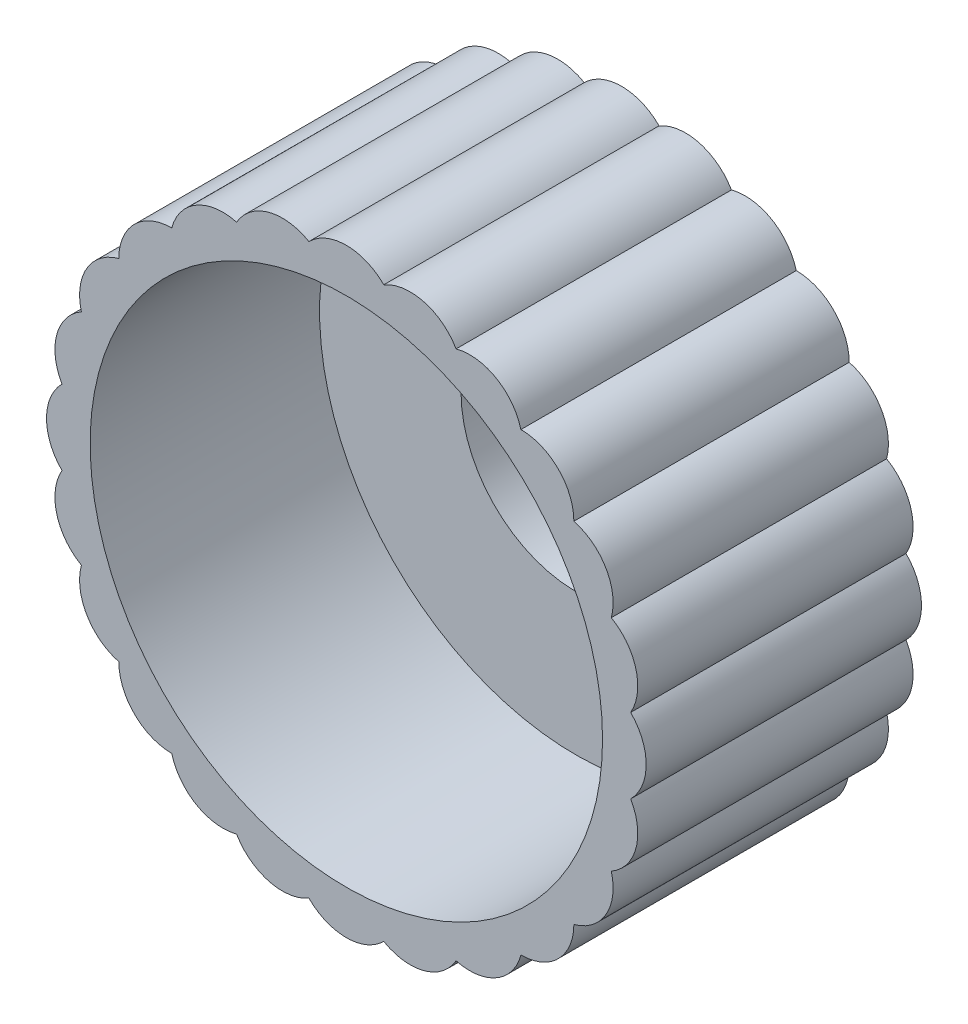
ISO-10303-21;
HEADER;
FILE_DESCRIPTION(('STEP AP214'),'2;1');
FILE_NAME('part.step','',(''),(''),'','','');
FILE_SCHEMA(('AUTOMOTIVE_DESIGN { 1 0 10303 214 1 1 1 1 }'));
ENDSEC;
DATA;
#1=APPLICATION_CONTEXT('core data for automotive mechanical design processes');
#2=APPLICATION_PROTOCOL_DEFINITION('international standard','automotive_design',2000,#1);
#3=PRODUCT_CONTEXT('',#1,'mechanical');
#4=PRODUCT('Part','Part','',(#3));
#5=PRODUCT_RELATED_PRODUCT_CATEGORY('part','',(#4));
#6=PRODUCT_DEFINITION_FORMATION('','',#4);
#7=PRODUCT_DEFINITION_CONTEXT('part definition',#1,'design');
#8=PRODUCT_DEFINITION('design','',#6,#7);
#9=PRODUCT_DEFINITION_SHAPE('','',#8);
#10=(LENGTH_UNIT() NAMED_UNIT(*) SI_UNIT(.MILLI.,.METRE.));
#11=(NAMED_UNIT(*) PLANE_ANGLE_UNIT() SI_UNIT($,.RADIAN.));
#12=(NAMED_UNIT(*) SI_UNIT($,.STERADIAN.) SOLID_ANGLE_UNIT());
#13=UNCERTAINTY_MEASURE_WITH_UNIT(LENGTH_MEASURE(1.E-05),#10,'distance_accuracy_value','');
#14=(GEOMETRIC_REPRESENTATION_CONTEXT(3) GLOBAL_UNCERTAINTY_ASSIGNED_CONTEXT((#13)) GLOBAL_UNIT_ASSIGNED_CONTEXT((#10,
#11,#12)) REPRESENTATION_CONTEXT('',''));
#15=CARTESIAN_POINT('',(0.,0.,0.));
#16=DIRECTION('',(0.,0.,1.));
#17=DIRECTION('',(1.,0.,0.));
#18=AXIS2_PLACEMENT_3D('',#15,#16,#17);
#19=CARTESIAN_POINT('',(0.,0.,15.));
#20=DIRECTION('',(0.,0.,1.));
#21=DIRECTION('',(1.,0.,0.));
#22=AXIS2_PLACEMENT_3D('',#19,#20,#21);
#23=PLANE('',#22);
#24=CARTESIAN_POINT('',(0.,16.142225046633,15.));
#25=DIRECTION('',(0.,0.,1.));
#26=DIRECTION('',(1.,0.,0.));
#27=AXIS2_PLACEMENT_3D('',#24,#25,#26);
#28=CIRCLE('',#27,3.46109833654717);
#29=CARTESIAN_POINT('',(-2.4473661041257,18.589591150759,15.));
#30=VERTEX_POINT('',#29);
#31=CARTESIAN_POINT('',(2.44736610412596,18.589591150759,15.));
#32=VERTEX_POINT('',#31);
#33=EDGE_CURVE('E202',#30,#32,#28,.F.);
#34=ORIENTED_EDGE('',*,*,#33,.F.);
#35=CARTESIAN_POINT('',(-4.17791527239933,15.5921920663131,15.));
#36=DIRECTION('',(0.,0.,1.));
#37=DIRECTION('',(1.,0.,0.));
#38=AXIS2_PLACEMENT_3D('',#35,#36,#37);
#39=CIRCLE('',#38,3.46109833654717);
#40=CARTESIAN_POINT('',(-7.17531435684522,17.3227412345867,15.));
#41=VERTEX_POINT('',#40);
#42=EDGE_CURVE('E195',#41,#30,#39,.F.);
#43=ORIENTED_EDGE('',*,*,#42,.F.);
#44=CARTESIAN_POINT('',(-8.07111252331631,13.9795769639897,15.));
#45=DIRECTION('',(0.,0.,1.));
#46=DIRECTION('',(1.,0.,0.));
#47=AXIS2_PLACEMENT_3D('',#44,#45,#46);
#48=CIRCLE('',#47,3.46109833654717);
#49=CARTESIAN_POINT('',(-11.4142767939133,14.8753751304608,15.));
#50=VERTEX_POINT('',#49);
#51=EDGE_CURVE('E199',#50,#41,#48,.F.);
#52=ORIENTED_EDGE('',*,*,#51,.F.);
#53=CARTESIAN_POINT('',(-11.4142767939134,11.4142767939136,15.));
#54=DIRECTION('',(0.,0.,1.));
#55=DIRECTION('',(1.,0.,0.));
#56=AXIS2_PLACEMENT_3D('',#53,#54,#55);
#57=CIRCLE('',#56,3.46109833654717);
#58=CARTESIAN_POINT('',(-14.8753751304605,11.4142767939137,15.));
#59=VERTEX_POINT('',#58);
#60=EDGE_CURVE('E226',#59,#50,#57,.F.);
#61=ORIENTED_EDGE('',*,*,#60,.F.);
#62=CARTESIAN_POINT('',(-13.9795769639895,8.07111252331665,15.));
#63=DIRECTION('',(0.,0.,1.));
#64=DIRECTION('',(1.,0.,0.));
#65=AXIS2_PLACEMENT_3D('',#62,#63,#64);
#66=CIRCLE('',#65,3.46109833654717);
#67=CARTESIAN_POINT('',(-17.3227412345866,7.17531435684562,15.));
#68=VERTEX_POINT('',#67);
#69=EDGE_CURVE('E234',#68,#59,#66,.F.);
#70=ORIENTED_EDGE('',*,*,#69,.F.);
#71=CARTESIAN_POINT('',(-15.592192066313,4.17791527239971,15.));
#72=DIRECTION('',(0.,0.,1.));
#73=DIRECTION('',(1.,0.,0.));
#74=AXIS2_PLACEMENT_3D('',#71,#72,#73);
#75=CIRCLE('',#74,3.46109833654717);
#76=CARTESIAN_POINT('',(-18.5895911507589,2.44736610412616,15.));
#77=VERTEX_POINT('',#76);
#78=EDGE_CURVE('E243',#77,#68,#75,.F.);
#79=ORIENTED_EDGE('',*,*,#78,.F.);
#80=CARTESIAN_POINT('',(-16.142225046633,1.69075025761758E-13,15.));
#81=DIRECTION('',(0.,0.,1.));
#82=DIRECTION('',(1.,0.,0.));
#83=AXIS2_PLACEMENT_3D('',#80,#81,#82);
#84=CIRCLE('',#83,3.46109833654717);
#85=CARTESIAN_POINT('',(-18.589591150759,-2.44736610412579,15.));
#86=VERTEX_POINT('',#85);
#87=EDGE_CURVE('E252',#86,#77,#84,.F.);
#88=ORIENTED_EDGE('',*,*,#87,.F.);
#89=CARTESIAN_POINT('',(-15.5921920663131,-4.17791527239939,15.));
#90=DIRECTION('',(0.,0.,1.));
#91=DIRECTION('',(1.,0.,0.));
#92=AXIS2_PLACEMENT_3D('',#89,#90,#91);
#93=CIRCLE('',#92,3.46109833654717);
#94=CARTESIAN_POINT('',(-17.3227412345867,-7.17531435684528,15.));
#95=VERTEX_POINT('',#94);
#96=EDGE_CURVE('E261',#95,#86,#93,.F.);
#97=ORIENTED_EDGE('',*,*,#96,.F.);
#98=CARTESIAN_POINT('',(-13.9795769639897,-8.07111252331635,15.));
#99=DIRECTION('',(0.,0.,1.));
#100=DIRECTION('',(1.,0.,0.));
#101=AXIS2_PLACEMENT_3D('',#98,#99,#100);
#102=CIRCLE('',#101,3.46109833654717);
#103=CARTESIAN_POINT('',(-14.8753751304608,-11.4142767939134,15.));
#104=VERTEX_POINT('',#103);
#105=EDGE_CURVE('E270',#104,#95,#102,.F.);
#106=ORIENTED_EDGE('',*,*,#105,.F.);
#107=CARTESIAN_POINT('',(-11.4142767939136,-11.4142767939134,15.));
#108=DIRECTION('',(0.,0.,1.));
#109=DIRECTION('',(1.,0.,0.));
#110=AXIS2_PLACEMENT_3D('',#107,#108,#109);
#111=CIRCLE('',#110,3.46109833654717);
#112=CARTESIAN_POINT('',(-11.4142767939136,-14.8753751304606,15.));
#113=VERTEX_POINT('',#112);
#114=EDGE_CURVE('E279',#113,#104,#111,.F.);
#115=ORIENTED_EDGE('',*,*,#114,.F.);
#116=CARTESIAN_POINT('',(-8.0711125233166,-13.9795769639895,15.));
#117=DIRECTION('',(0.,0.,1.));
#118=DIRECTION('',(1.,0.,0.));
#119=AXIS2_PLACEMENT_3D('',#116,#117,#118);
#120=CIRCLE('',#119,3.46109833654717);
#121=CARTESIAN_POINT('',(-7.17531435684556,-17.3227412345866,15.));
#122=VERTEX_POINT('',#121);
#123=EDGE_CURVE('E288',#122,#113,#120,.F.);
#124=ORIENTED_EDGE('',*,*,#123,.F.);
#125=CARTESIAN_POINT('',(-4.17791527239966,-15.592192066313,15.));
#126=DIRECTION('',(0.,0.,1.));
#127=DIRECTION('',(1.,0.,0.));
#128=AXIS2_PLACEMENT_3D('',#125,#126,#127);
#129=CIRCLE('',#128,3.46109833654717);
#130=CARTESIAN_POINT('',(-2.44736610412609,-18.5895911507589,15.));
#131=VERTEX_POINT('',#130);
#132=EDGE_CURVE('E297',#131,#122,#129,.F.);
#133=ORIENTED_EDGE('',*,*,#132,.F.);
#134=CARTESIAN_POINT('',(0.,-16.142225046633,15.));
#135=DIRECTION('',(0.,0.,1.));
#136=DIRECTION('',(1.,0.,0.));
#137=AXIS2_PLACEMENT_3D('',#134,#135,#136);
#138=CIRCLE('',#137,3.46109833654717);
#139=CARTESIAN_POINT('',(2.44736610412599,-18.589591150759,15.));
#140=VERTEX_POINT('',#139);
#141=EDGE_CURVE('E306',#140,#131,#138,.F.);
#142=ORIENTED_EDGE('',*,*,#141,.F.);
#143=CARTESIAN_POINT('',(4.17791527239944,-15.5921920663131,15.));
#144=DIRECTION('',(0.,0.,1.));
#145=DIRECTION('',(1.,0.,0.));
#146=AXIS2_PLACEMENT_3D('',#143,#144,#145);
#147=CIRCLE('',#146,3.46109833654717);
#148=CARTESIAN_POINT('',(7.17531435684534,-17.3227412345867,15.));
#149=VERTEX_POINT('',#148);
#150=EDGE_CURVE('E315',#149,#140,#147,.F.);
#151=ORIENTED_EDGE('',*,*,#150,.F.);
#152=CARTESIAN_POINT('',(8.0711125233164,-13.9795769639896,15.));
#153=DIRECTION('',(0.,0.,1.));
#154=DIRECTION('',(1.,0.,0.));
#155=AXIS2_PLACEMENT_3D('',#152,#153,#154);
#156=CIRCLE('',#155,3.46109833654717);
#157=CARTESIAN_POINT('',(11.4142767939134,-14.8753751304607,15.));
#158=VERTEX_POINT('',#157);
#159=EDGE_CURVE('E324',#158,#149,#156,.F.);
#160=ORIENTED_EDGE('',*,*,#159,.F.);
#161=CARTESIAN_POINT('',(11.4142767939134,-11.4142767939136,15.));
#162=DIRECTION('',(0.,0.,1.));
#163=DIRECTION('',(1.,0.,0.));
#164=AXIS2_PLACEMENT_3D('',#161,#162,#163);
#165=CIRCLE('',#164,3.46109833654717);
#166=CARTESIAN_POINT('',(14.8753751304606,-11.4142767939136,15.));
#167=VERTEX_POINT('',#166);
#168=EDGE_CURVE('E333',#167,#158,#165,.F.);
#169=ORIENTED_EDGE('',*,*,#168,.F.);
#170=CARTESIAN_POINT('',(13.9795769639896,-8.07111252331655,15.));
#171=DIRECTION('',(0.,0.,1.));
#172=DIRECTION('',(1.,0.,0.));
#173=AXIS2_PLACEMENT_3D('',#170,#171,#172);
#174=CIRCLE('',#173,3.46109833654717);
#175=CARTESIAN_POINT('',(17.3227412345866,-7.1753143568455,15.));
#176=VERTEX_POINT('',#175);
#177=EDGE_CURVE('E342',#176,#167,#174,.F.);
#178=ORIENTED_EDGE('',*,*,#177,.F.);
#179=CARTESIAN_POINT('',(15.592192066313,-4.1779152723996,15.));
#180=DIRECTION('',(0.,0.,1.));
#181=DIRECTION('',(1.,0.,0.));
#182=AXIS2_PLACEMENT_3D('',#179,#180,#181);
#183=CIRCLE('',#182,3.46109833654717);
#184=CARTESIAN_POINT('',(18.5895911507589,-2.44736610412602,15.));
#185=VERTEX_POINT('',#184);
#186=EDGE_CURVE('E351',#185,#176,#183,.F.);
#187=ORIENTED_EDGE('',*,*,#186,.F.);
#188=CARTESIAN_POINT('',(16.142225046633,0.,15.));
#189=DIRECTION('',(0.,0.,1.));
#190=DIRECTION('',(1.,0.,0.));
#191=AXIS2_PLACEMENT_3D('',#188,#189,#190);
#192=CIRCLE('',#191,3.46109833654717);
#193=CARTESIAN_POINT('',(18.589591150759,2.44736610412592,15.));
#194=VERTEX_POINT('',#193);
#195=EDGE_CURVE('E360',#194,#185,#192,.F.);
#196=ORIENTED_EDGE('',*,*,#195,.F.);
#197=CARTESIAN_POINT('',(15.5921920663131,4.17791527239949,15.));
#198=DIRECTION('',(0.,0.,1.));
#199=DIRECTION('',(1.,0.,0.));
#200=AXIS2_PLACEMENT_3D('',#197,#198,#199);
#201=CIRCLE('',#200,3.46109833654717);
#202=CARTESIAN_POINT('',(17.3227412345867,7.1753143568454,15.));
#203=VERTEX_POINT('',#202);
#204=EDGE_CURVE('E369',#203,#194,#201,.F.);
#205=ORIENTED_EDGE('',*,*,#204,.F.);
#206=CARTESIAN_POINT('',(13.9795769639896,8.07111252331645,15.));
#207=DIRECTION('',(0.,0.,1.));
#208=DIRECTION('',(1.,0.,0.));
#209=AXIS2_PLACEMENT_3D('',#206,#207,#208);
#210=CIRCLE('',#209,3.46109833654717);
#211=CARTESIAN_POINT('',(14.8753751304607,11.4142767939135,15.));
#212=VERTEX_POINT('',#211);
#213=EDGE_CURVE('E378',#212,#203,#210,.F.);
#214=ORIENTED_EDGE('',*,*,#213,.F.);
#215=CARTESIAN_POINT('',(11.4142767939135,11.4142767939135,15.));
#216=DIRECTION('',(0.,0.,1.));
#217=DIRECTION('',(1.,0.,0.));
#218=AXIS2_PLACEMENT_3D('',#215,#216,#217);
#219=CIRCLE('',#218,3.46109833654717);
#220=CARTESIAN_POINT('',(11.4142767939135,14.8753751304607,15.));
#221=VERTEX_POINT('',#220);
#222=EDGE_CURVE('E386',#221,#212,#219,.F.);
#223=ORIENTED_EDGE('',*,*,#222,.F.);
#224=CARTESIAN_POINT('',(8.0711125233165,13.9795769639896,15.));
#225=DIRECTION('',(0.,0.,1.));
#226=DIRECTION('',(1.,0.,0.));
#227=AXIS2_PLACEMENT_3D('',#224,#225,#226);
#228=CIRCLE('',#227,3.46109833654717);
#229=CARTESIAN_POINT('',(7.17531435684544,17.3227412345866,15.));
#230=VERTEX_POINT('',#229);
#231=EDGE_CURVE('E393',#230,#221,#228,.F.);
#232=ORIENTED_EDGE('',*,*,#231,.F.);
#233=CARTESIAN_POINT('',(4.17791527239955,15.592192066313,15.));
#234=DIRECTION('',(0.,0.,1.));
#235=DIRECTION('',(1.,0.,0.));
#236=AXIS2_PLACEMENT_3D('',#233,#234,#235);
#237=CIRCLE('',#236,3.46109833654717);
#238=EDGE_CURVE('E398',#32,#230,#237,.F.);
#239=ORIENTED_EDGE('',*,*,#238,.F.);
#240=EDGE_LOOP('',(#34,#43,#52,#61,#70,#79,#88,#97,#106,#115,#124,#133,#142,#151,#160,#169,#178,
#187,#196,#205,#214,#223,#232,#239));
#241=FACE_BOUND('',#240,.T.);
#242=CARTESIAN_POINT('',(0.,0.,15.));
#243=DIRECTION('',(0.,0.,1.));
#244=DIRECTION('',(1.,0.,0.));
#245=AXIS2_PLACEMENT_3D('',#242,#243,#244);
#246=CIRCLE('',#245,16.75);
#247=CARTESIAN_POINT('',(16.75,0.,15.));
#248=VERTEX_POINT('',#247);
#249=EDGE_CURVE('E11',#248,#248,#246,.T.);
#250=ORIENTED_EDGE('',*,*,#249,.F.);
#251=EDGE_LOOP('',(#250));
#252=FACE_BOUND('',#251,.T.);
#253=ADVANCED_FACE('F33',(#241,#252),#23,.T.);
#254=CARTESIAN_POINT('',(0.,0.,15.));
#255=DIRECTION('',(0.,0.,-1.));
#256=DIRECTION('',(-1.,0.,0.));
#257=AXIS2_PLACEMENT_3D('',#254,#255,#256);
#258=CYLINDRICAL_SURFACE('',#257,16.75);
#259=ORIENTED_EDGE('',*,*,#249,.T.);
#260=EDGE_LOOP('',(#259));
#261=FACE_BOUND('',#260,.T.);
#262=CARTESIAN_POINT('',(0.,0.,0.));
#263=DIRECTION('',(0.,0.,1.));
#264=DIRECTION('',(1.,0.,0.));
#265=AXIS2_PLACEMENT_3D('',#262,#263,#264);
#266=CIRCLE('',#265,16.75);
#267=CARTESIAN_POINT('',(16.75,0.,0.));
#268=VERTEX_POINT('',#267);
#269=EDGE_CURVE('E36',#268,#268,#266,.T.);
#270=ORIENTED_EDGE('',*,*,#269,.F.);
#271=EDGE_LOOP('',(#270));
#272=FACE_BOUND('',#271,.T.);
#273=ADVANCED_FACE('F437',(#261,#272),#258,.F.);
#274=CARTESIAN_POINT('',(0.,0.,0.));
#275=DIRECTION('',(0.,0.,-1.));
#276=DIRECTION('',(-1.,0.,0.));
#277=AXIS2_PLACEMENT_3D('',#274,#275,#276);
#278=PLANE('',#277);
#279=CARTESIAN_POINT('',(0.,0.,0.));
#280=DIRECTION('',(0.,0.,-1.));
#281=DIRECTION('',(-1.,0.,0.));
#282=AXIS2_PLACEMENT_3D('',#279,#280,#281);
#283=CIRCLE('',#282,7.5);
#284=CARTESIAN_POINT('',(-7.5,0.,0.));
#285=VERTEX_POINT('',#284);
#286=EDGE_CURVE('E411',#285,#285,#283,.T.);
#287=ORIENTED_EDGE('',*,*,#286,.T.);
#288=EDGE_LOOP('',(#287));
#289=FACE_BOUND('',#288,.T.);
#290=ORIENTED_EDGE('',*,*,#269,.T.);
#291=EDGE_LOOP('',(#290));
#292=FACE_BOUND('',#291,.T.);
#293=ADVANCED_FACE('F418',(#289,#292),#278,.F.);
#294=CARTESIAN_POINT('',(0.,0.,-3.));
#295=DIRECTION('',(0.,0.,-1.));
#296=DIRECTION('',(-1.,0.,0.));
#297=AXIS2_PLACEMENT_3D('',#294,#295,#296);
#298=PLANE('',#297);
#299=CARTESIAN_POINT('',(0.,16.142225046633,-3.));
#300=DIRECTION('',(0.,0.,-1.));
#301=DIRECTION('',(1.,0.,0.));
#302=AXIS2_PLACEMENT_3D('',#299,#300,#301);
#303=CIRCLE('',#302,3.46109833654717);
#304=CARTESIAN_POINT('',(-2.4473661041257,18.589591150759,-3.));
#305=VERTEX_POINT('',#304);
#306=CARTESIAN_POINT('',(2.44736610412599,18.589591150759,-3.));
#307=VERTEX_POINT('',#306);
#308=EDGE_CURVE('E403',#305,#307,#303,.T.);
#309=ORIENTED_EDGE('',*,*,#308,.T.);
#310=CARTESIAN_POINT('',(4.17791527239955,15.592192066313,-3.));
#311=DIRECTION('',(0.,0.,-1.));
#312=DIRECTION('',(0.965925826289068,-0.258819045102521,0.));
#313=AXIS2_PLACEMENT_3D('',#310,#311,#312);
#314=CIRCLE('',#313,3.46109833654717);
#315=CARTESIAN_POINT('',(7.17531435684547,17.3227412345866,-3.));
#316=VERTEX_POINT('',#315);
#317=EDGE_CURVE('E47',#307,#316,#314,.T.);
#318=ORIENTED_EDGE('',*,*,#317,.T.);
#319=CARTESIAN_POINT('',(8.0711125233165,13.9795769639896,-3.));
#320=DIRECTION('',(0.,0.,-1.));
#321=DIRECTION('',(0.866025403784438,-0.500000000000001,0.));
#322=AXIS2_PLACEMENT_3D('',#319,#320,#321);
#323=CIRCLE('',#322,3.46109833654717);
#324=CARTESIAN_POINT('',(11.4142767939136,14.8753751304606,-3.));
#325=VERTEX_POINT('',#324);
#326=EDGE_CURVE('E56',#316,#325,#323,.T.);
#327=ORIENTED_EDGE('',*,*,#326,.T.);
#328=CARTESIAN_POINT('',(11.4142767939135,11.4142767939135,-3.));
#329=DIRECTION('',(0.,0.,-1.));
#330=DIRECTION('',(0.707106781186546,-0.707106781186549,0.));
#331=AXIS2_PLACEMENT_3D('',#328,#329,#330);
#332=CIRCLE('',#331,3.46109833654717);
#333=CARTESIAN_POINT('',(14.8753751304607,11.4142767939135,-3.));
#334=VERTEX_POINT('',#333);
#335=EDGE_CURVE('E377',#325,#334,#332,.T.);
#336=ORIENTED_EDGE('',*,*,#335,.T.);
#337=CARTESIAN_POINT('',(13.9795769639896,8.07111252331645,-3.));
#338=DIRECTION('',(0.,0.,-1.));
#339=DIRECTION('',(0.499999999999998,-0.86602540378444,0.));
#340=AXIS2_PLACEMENT_3D('',#337,#338,#339);
#341=CIRCLE('',#340,3.46109833654717);
#342=CARTESIAN_POINT('',(17.3227412345867,7.17531435684538,-3.));
#343=VERTEX_POINT('',#342);
#344=EDGE_CURVE('E368',#334,#343,#341,.T.);
#345=ORIENTED_EDGE('',*,*,#344,.T.);
#346=CARTESIAN_POINT('',(15.5921920663131,4.17791527239949,-3.));
#347=DIRECTION('',(0.,0.,-1.));
#348=DIRECTION('',(0.258819045102518,-0.965925826289069,0.));
#349=AXIS2_PLACEMENT_3D('',#346,#347,#348);
#350=CIRCLE('',#349,3.46109833654717);
#351=CARTESIAN_POINT('',(18.589591150759,2.4473661041259,-3.));
#352=VERTEX_POINT('',#351);
#353=EDGE_CURVE('E359',#343,#352,#350,.T.);
#354=ORIENTED_EDGE('',*,*,#353,.T.);
#355=CARTESIAN_POINT('',(16.142225046633,0.,-3.));
#356=DIRECTION('',(0.,0.,-1.));
#357=DIRECTION('',(0.,-1.,0.));
#358=AXIS2_PLACEMENT_3D('',#355,#356,#357);
#359=CIRCLE('',#358,3.46109833654717);
#360=CARTESIAN_POINT('',(18.5895911507589,-2.44736610412605,-3.));
#361=VERTEX_POINT('',#360);
#362=EDGE_CURVE('E350',#352,#361,#359,.T.);
#363=ORIENTED_EDGE('',*,*,#362,.T.);
#364=CARTESIAN_POINT('',(15.592192066313,-4.1779152723996,-3.));
#365=DIRECTION('',(0.,0.,-1.));
#366=DIRECTION('',(-0.258819045102525,-0.965925826289067,0.));
#367=AXIS2_PLACEMENT_3D('',#364,#365,#366);
#368=CIRCLE('',#367,3.46109833654717);
#369=CARTESIAN_POINT('',(17.3227412345866,-7.17531435684553,-3.));
#370=VERTEX_POINT('',#369);
#371=EDGE_CURVE('E341',#361,#370,#368,.T.);
#372=ORIENTED_EDGE('',*,*,#371,.T.);
#373=CARTESIAN_POINT('',(13.9795769639896,-8.07111252331655,-3.));
#374=DIRECTION('',(0.,0.,-1.));
#375=DIRECTION('',(-0.500000000000004,-0.866025403784436,0.));
#376=AXIS2_PLACEMENT_3D('',#373,#374,#375);
#377=CIRCLE('',#376,3.46109833654717);
#378=CARTESIAN_POINT('',(14.8753751304606,-11.4142767939136,-3.));
#379=VERTEX_POINT('',#378);
#380=EDGE_CURVE('E332',#370,#379,#377,.T.);
#381=ORIENTED_EDGE('',*,*,#380,.T.);
#382=CARTESIAN_POINT('',(11.4142767939134,-11.4142767939136,-3.));
#383=DIRECTION('',(0.,0.,-1.));
#384=DIRECTION('',(-0.707106781186551,-0.707106781186544,0.));
#385=AXIS2_PLACEMENT_3D('',#382,#383,#384);
#386=CIRCLE('',#385,3.46109833654717);
#387=CARTESIAN_POINT('',(11.4142767939134,-14.8753751304607,-3.));
#388=VERTEX_POINT('',#387);
#389=EDGE_CURVE('E323',#379,#388,#386,.T.);
#390=ORIENTED_EDGE('',*,*,#389,.T.);
#391=CARTESIAN_POINT('',(8.0711125233164,-13.9795769639896,-3.));
#392=DIRECTION('',(0.,0.,-1.));
#393=DIRECTION('',(-0.866025403784442,-0.499999999999995,0.));
#394=AXIS2_PLACEMENT_3D('',#391,#392,#393);
#395=CIRCLE('',#394,3.46109833654717);
#396=CARTESIAN_POINT('',(7.17531435684532,-17.3227412345867,-3.));
#397=VERTEX_POINT('',#396);
#398=EDGE_CURVE('E314',#388,#397,#395,.T.);
#399=ORIENTED_EDGE('',*,*,#398,.T.);
#400=CARTESIAN_POINT('',(4.17791527239944,-15.5921920663131,-3.));
#401=DIRECTION('',(0.,0.,-1.));
#402=DIRECTION('',(-0.96592582628907,-0.258819045102515,0.));
#403=AXIS2_PLACEMENT_3D('',#400,#401,#402);
#404=CIRCLE('',#403,3.46109833654717);
#405=CARTESIAN_POINT('',(2.44736610412583,-18.589591150759,-3.));
#406=VERTEX_POINT('',#405);
#407=EDGE_CURVE('E305',#397,#406,#404,.T.);
#408=ORIENTED_EDGE('',*,*,#407,.T.);
#409=CARTESIAN_POINT('',(0.,-16.142225046633,-3.));
#410=DIRECTION('',(0.,0.,-1.));
#411=DIRECTION('',(-1.,0.,0.));
#412=AXIS2_PLACEMENT_3D('',#409,#410,#411);
#413=CIRCLE('',#412,3.46109833654717);
#414=CARTESIAN_POINT('',(-2.44736610412599,-18.589591150759,-3.));
#415=VERTEX_POINT('',#414);
#416=EDGE_CURVE('E296',#406,#415,#413,.T.);
#417=ORIENTED_EDGE('',*,*,#416,.T.);
#418=CARTESIAN_POINT('',(-4.17791527239966,-15.592192066313,-3.));
#419=DIRECTION('',(0.,0.,-1.));
#420=DIRECTION('',(-0.965925826289066,0.258819045102528,0.));
#421=AXIS2_PLACEMENT_3D('',#418,#419,#420);
#422=CIRCLE('',#421,3.46109833654717);
#423=CARTESIAN_POINT('',(-7.17531435684559,-17.3227412345866,-3.));
#424=VERTEX_POINT('',#423);
#425=EDGE_CURVE('E287',#415,#424,#422,.T.);
#426=ORIENTED_EDGE('',*,*,#425,.T.);
#427=CARTESIAN_POINT('',(-8.0711125233166,-13.9795769639895,-3.));
#428=DIRECTION('',(0.,0.,-1.));
#429=DIRECTION('',(-0.866025403784435,0.500000000000007,0.));
#430=AXIS2_PLACEMENT_3D('',#427,#428,#429);
#431=CIRCLE('',#430,3.46109833654717);
#432=CARTESIAN_POINT('',(-11.4142767939137,-14.8753751304606,-3.));
#433=VERTEX_POINT('',#432);
#434=EDGE_CURVE('E278',#424,#433,#431,.T.);
#435=ORIENTED_EDGE('',*,*,#434,.T.);
#436=CARTESIAN_POINT('',(-11.4142767939136,-11.4142767939134,-3.));
#437=DIRECTION('',(0.,0.,-1.));
#438=DIRECTION('',(-0.707106781186541,0.707106781186554,0.));
#439=AXIS2_PLACEMENT_3D('',#436,#437,#438);
#440=CIRCLE('',#439,3.46109833654717);
#441=CARTESIAN_POINT('',(-14.8753751304608,-11.4142767939134,-3.));
#442=VERTEX_POINT('',#441);
#443=EDGE_CURVE('E269',#433,#442,#440,.T.);
#444=ORIENTED_EDGE('',*,*,#443,.T.);
#445=CARTESIAN_POINT('',(-13.9795769639897,-8.07111252331635,-3.));
#446=DIRECTION('',(0.,0.,-1.));
#447=DIRECTION('',(-0.499999999999992,0.866025403784443,0.));
#448=AXIS2_PLACEMENT_3D('',#445,#446,#447);
#449=CIRCLE('',#448,3.46109833654717);
#450=CARTESIAN_POINT('',(-17.3227412345867,-7.17531435684526,-3.));
#451=VERTEX_POINT('',#450);
#452=EDGE_CURVE('E260',#442,#451,#449,.T.);
#453=ORIENTED_EDGE('',*,*,#452,.T.);
#454=CARTESIAN_POINT('',(-15.5921920663131,-4.17791527239939,-3.));
#455=DIRECTION('',(0.,0.,-1.));
#456=DIRECTION('',(-0.258819045102511,0.965925826289071,0.));
#457=AXIS2_PLACEMENT_3D('',#454,#455,#456);
#458=CIRCLE('',#457,3.46109833654717);
#459=CARTESIAN_POINT('',(-18.589591150759,-2.44736610412577,-3.));
#460=VERTEX_POINT('',#459);
#461=EDGE_CURVE('E251',#451,#460,#458,.T.);
#462=ORIENTED_EDGE('',*,*,#461,.T.);
#463=CARTESIAN_POINT('',(-16.142225046633,1.69075025761758E-13,-3.));
#464=DIRECTION('',(0.,0.,-1.));
#465=DIRECTION('',(0.,1.,0.));
#466=AXIS2_PLACEMENT_3D('',#463,#464,#465);
#467=CIRCLE('',#466,3.46109833654717);
#468=CARTESIAN_POINT('',(-18.5895911507589,2.44736610412618,-3.));
#469=VERTEX_POINT('',#468);
#470=EDGE_CURVE('E242',#460,#469,#467,.T.);
#471=ORIENTED_EDGE('',*,*,#470,.T.);
#472=CARTESIAN_POINT('',(-15.592192066313,4.17791527239971,-3.));
#473=DIRECTION('',(0.,0.,-1.));
#474=DIRECTION('',(0.258819045102531,0.965925826289065,0.));
#475=AXIS2_PLACEMENT_3D('',#472,#473,#474);
#476=CIRCLE('',#475,3.46109833654717);
#477=CARTESIAN_POINT('',(-17.3227412345866,7.17531435684565,-3.));
#478=VERTEX_POINT('',#477);
#479=EDGE_CURVE('E233',#469,#478,#476,.T.);
#480=ORIENTED_EDGE('',*,*,#479,.T.);
#481=CARTESIAN_POINT('',(-13.9795769639895,8.07111252331665,-3.));
#482=DIRECTION('',(0.,0.,-1.));
#483=DIRECTION('',(0.50000000000001,0.866025403784433,0.));
#484=AXIS2_PLACEMENT_3D('',#481,#482,#483);
#485=CIRCLE('',#484,3.46109833654717);
#486=CARTESIAN_POINT('',(-14.8753751304605,11.4142767939137,-3.));
#487=VERTEX_POINT('',#486);
#488=EDGE_CURVE('E225',#478,#487,#485,.T.);
#489=ORIENTED_EDGE('',*,*,#488,.T.);
#490=CARTESIAN_POINT('',(-11.4142767939134,11.4142767939136,-3.));
#491=DIRECTION('',(0.,0.,-1.));
#492=DIRECTION('',(0.707106781186556,0.707106781186539,0.));
#493=AXIS2_PLACEMENT_3D('',#490,#491,#492);
#494=CIRCLE('',#493,3.46109833654717);
#495=CARTESIAN_POINT('',(-11.4142767939133,14.8753751304608,-3.));
#496=VERTEX_POINT('',#495);
#497=EDGE_CURVE('E214',#487,#496,#494,.T.);
#498=ORIENTED_EDGE('',*,*,#497,.T.);
#499=CARTESIAN_POINT('',(-8.07111252331631,13.9795769639897,-3.));
#500=DIRECTION('',(0.,0.,-1.));
#501=DIRECTION('',(0.866025403784445,0.499999999999989,0.));
#502=AXIS2_PLACEMENT_3D('',#499,#500,#501);
#503=CIRCLE('',#502,3.46109833654717);
#504=CARTESIAN_POINT('',(-7.1753143568452,17.3227412345867,-3.));
#505=VERTEX_POINT('',#504);
#506=EDGE_CURVE('E205',#496,#505,#503,.T.);
#507=ORIENTED_EDGE('',*,*,#506,.T.);
#508=CARTESIAN_POINT('',(-4.17791527239933,15.5921920663131,-3.));
#509=DIRECTION('',(0.,0.,-1.));
#510=DIRECTION('',(0.965925826289072,0.258819045102508,0.));
#511=AXIS2_PLACEMENT_3D('',#508,#509,#510);
#512=CIRCLE('',#511,3.46109833654717);
#513=EDGE_CURVE('E206',#505,#305,#512,.T.);
#514=ORIENTED_EDGE('',*,*,#513,.T.);
#515=EDGE_LOOP('',(#309,#318,#327,#336,#345,#354,#363,#372,#381,#390,#399,#408,#417,#426,#435,
#444,#453,#462,#471,#480,#489,#498,#507,#514));
#516=FACE_BOUND('',#515,.T.);
#517=CARTESIAN_POINT('',(0.,0.,-3.));
#518=DIRECTION('',(0.,0.,-1.));
#519=DIRECTION('',(-1.,0.,0.));
#520=AXIS2_PLACEMENT_3D('',#517,#518,#519);
#521=CIRCLE('',#520,7.5);
#522=CARTESIAN_POINT('',(-7.5,0.,-3.));
#523=VERTEX_POINT('',#522);
#524=EDGE_CURVE('E412',#523,#523,#521,.T.);
#525=ORIENTED_EDGE('',*,*,#524,.F.);
#526=EDGE_LOOP('',(#525));
#527=FACE_BOUND('',#526,.T.);
#528=ADVANCED_FACE('F424',(#516,#527),#298,.T.);
#529=CARTESIAN_POINT('',(0.,0.,-3.));
#530=DIRECTION('',(0.,0.,1.));
#531=DIRECTION('',(1.,0.,0.));
#532=AXIS2_PLACEMENT_3D('',#529,#530,#531);
#533=CYLINDRICAL_SURFACE('',#532,7.5);
#534=ORIENTED_EDGE('',*,*,#524,.T.);
#535=EDGE_LOOP('',(#534));
#536=FACE_BOUND('',#535,.T.);
#537=ORIENTED_EDGE('',*,*,#286,.F.);
#538=EDGE_LOOP('',(#537));
#539=FACE_BOUND('',#538,.T.);
#540=ADVANCED_FACE('F421',(#536,#539),#533,.F.);
#541=CARTESIAN_POINT('',(0.,16.142225046633,19.9986054484775));
#542=DIRECTION('',(0.,0.,-1.));
#543=DIRECTION('',(-1.,0.,0.));
#544=AXIS2_PLACEMENT_3D('',#541,#542,#543);
#545=CYLINDRICAL_SURFACE('',#544,3.46109833654717);
#546=DIRECTION('',(0.,0.,-1.));
#547=VECTOR('',#546,1.);
#548=CARTESIAN_POINT('',(-2.44736610412599,18.589591150759,19.9986054484775));
#549=LINE('',#548,#547);
#550=EDGE_CURVE('E409',#30,#305,#549,.T.);
#551=ORIENTED_EDGE('',*,*,#550,.F.);
#552=ORIENTED_EDGE('',*,*,#33,.T.);
#553=DIRECTION('',(0.,0.,-1.));
#554=VECTOR('',#553,1.);
#555=CARTESIAN_POINT('',(2.44736610412599,18.589591150759,19.9986054484775));
#556=LINE('',#555,#554);
#557=EDGE_CURVE('E406',#32,#307,#556,.T.);
#558=ORIENTED_EDGE('',*,*,#557,.T.);
#559=ORIENTED_EDGE('',*,*,#308,.F.);
#560=EDGE_LOOP('',(#551,#552,#558,#559));
#561=FACE_BOUND('',#560,.T.);
#562=ADVANCED_FACE('F423',(#561),#545,.T.);
#563=CARTESIAN_POINT('',(4.17791527239955,15.592192066313,20.0347090386839));
#564=DIRECTION('',(0.,0.,-1.));
#565=DIRECTION('',(-1.,0.,0.));
#566=AXIS2_PLACEMENT_3D('',#563,#564,#565);
#567=CYLINDRICAL_SURFACE('',#566,3.46109833654717);
#568=ORIENTED_EDGE('',*,*,#557,.F.);
#569=ORIENTED_EDGE('',*,*,#238,.T.);
#570=DIRECTION('',(0.,0.,-1.));
#571=VECTOR('',#570,1.);
#572=CARTESIAN_POINT('',(7.17531435684547,17.3227412345866,20.0347090386839));
#573=LINE('',#572,#571);
#574=EDGE_CURVE('E401',#230,#316,#573,.T.);
#575=ORIENTED_EDGE('',*,*,#574,.T.);
#576=ORIENTED_EDGE('',*,*,#317,.F.);
#577=EDGE_LOOP('',(#568,#569,#575,#576));
#578=FACE_BOUND('',#577,.T.);
#579=ADVANCED_FACE('F431',(#578),#567,.T.);
#580=CARTESIAN_POINT('',(8.0711125233165,13.9795769639896,19.9547520125095));
#581=DIRECTION('',(0.,0.,-1.));
#582=DIRECTION('',(-1.,0.,0.));
#583=AXIS2_PLACEMENT_3D('',#580,#581,#582);
#584=CYLINDRICAL_SURFACE('',#583,3.46109833654717);
#585=ORIENTED_EDGE('',*,*,#574,.F.);
#586=ORIENTED_EDGE('',*,*,#231,.T.);
#587=DIRECTION('',(0.,0.,-1.));
#588=VECTOR('',#587,1.);
#589=CARTESIAN_POINT('',(11.4142767939136,14.8753751304606,19.9547520125095));
#590=LINE('',#589,#588);
#591=EDGE_CURVE('E391',#221,#325,#590,.T.);
#592=ORIENTED_EDGE('',*,*,#591,.T.);
#593=ORIENTED_EDGE('',*,*,#326,.F.);
#594=EDGE_LOOP('',(#585,#586,#592,#593));
#595=FACE_BOUND('',#594,.T.);
#596=ADVANCED_FACE('F476',(#595),#584,.T.);
#597=CARTESIAN_POINT('',(11.4142767939135,11.4142767939135,19.894732208252));
#598=DIRECTION('',(0.,0.,-1.));
#599=DIRECTION('',(-1.,0.,0.));
#600=AXIS2_PLACEMENT_3D('',#597,#598,#599);
#601=CYLINDRICAL_SURFACE('',#600,3.46109833654717);
#602=ORIENTED_EDGE('',*,*,#591,.F.);
#603=ORIENTED_EDGE('',*,*,#222,.T.);
#604=DIRECTION('',(0.,0.,-1.));
#605=VECTOR('',#604,1.);
#606=CARTESIAN_POINT('',(14.8753751304607,11.4142767939135,19.894732208252));
#607=LINE('',#606,#605);
#608=EDGE_CURVE('E383',#212,#334,#607,.T.);
#609=ORIENTED_EDGE('',*,*,#608,.T.);
#610=ORIENTED_EDGE('',*,*,#335,.F.);
#611=EDGE_LOOP('',(#602,#603,#609,#610));
#612=FACE_BOUND('',#611,.T.);
#613=ADVANCED_FACE('F485',(#612),#601,.T.);
#614=CARTESIAN_POINT('',(13.9795769639896,8.07111252331645,19.9547520125095));
#615=DIRECTION('',(0.,0.,-1.));
#616=DIRECTION('',(-1.,0.,0.));
#617=AXIS2_PLACEMENT_3D('',#614,#615,#616);
#618=CYLINDRICAL_SURFACE('',#617,3.46109833654717);
#619=ORIENTED_EDGE('',*,*,#608,.F.);
#620=ORIENTED_EDGE('',*,*,#213,.T.);
#621=DIRECTION('',(0.,0.,-1.));
#622=VECTOR('',#621,1.);
#623=CARTESIAN_POINT('',(17.3227412345867,7.17531435684538,19.9547520125095));
#624=LINE('',#623,#622);
#625=EDGE_CURVE('E374',#203,#343,#624,.T.);
#626=ORIENTED_EDGE('',*,*,#625,.T.);
#627=ORIENTED_EDGE('',*,*,#344,.F.);
#628=EDGE_LOOP('',(#619,#620,#626,#627));
#629=FACE_BOUND('',#628,.T.);
#630=ADVANCED_FACE('F494',(#629),#618,.T.);
#631=CARTESIAN_POINT('',(15.5921920663131,4.17791527239949,20.0347090386839));
#632=DIRECTION('',(0.,0.,-1.));
#633=DIRECTION('',(-1.,0.,0.));
#634=AXIS2_PLACEMENT_3D('',#631,#632,#633);
#635=CYLINDRICAL_SURFACE('',#634,3.46109833654717);
#636=ORIENTED_EDGE('',*,*,#625,.F.);
#637=ORIENTED_EDGE('',*,*,#204,.T.);
#638=DIRECTION('',(0.,0.,-1.));
#639=VECTOR('',#638,1.);
#640=CARTESIAN_POINT('',(18.589591150759,2.4473661041259,20.0347090386839));
#641=LINE('',#640,#639);
#642=EDGE_CURVE('E365',#194,#352,#641,.T.);
#643=ORIENTED_EDGE('',*,*,#642,.T.);
#644=ORIENTED_EDGE('',*,*,#353,.F.);
#645=EDGE_LOOP('',(#636,#637,#643,#644));
#646=FACE_BOUND('',#645,.T.);
#647=ADVANCED_FACE('F504',(#646),#635,.T.);
#648=CARTESIAN_POINT('',(16.142225046633,0.,19.9986054484775));
#649=DIRECTION('',(0.,0.,-1.));
#650=DIRECTION('',(-1.,0.,0.));
#651=AXIS2_PLACEMENT_3D('',#648,#649,#650);
#652=CYLINDRICAL_SURFACE('',#651,3.46109833654717);
#653=ORIENTED_EDGE('',*,*,#642,.F.);
#654=ORIENTED_EDGE('',*,*,#195,.T.);
#655=DIRECTION('',(0.,0.,-1.));
#656=VECTOR('',#655,1.);
#657=CARTESIAN_POINT('',(18.5895911507589,-2.44736610412605,19.9986054484775));
#658=LINE('',#657,#656);
#659=EDGE_CURVE('E356',#185,#361,#658,.T.);
#660=ORIENTED_EDGE('',*,*,#659,.T.);
#661=ORIENTED_EDGE('',*,*,#362,.F.);
#662=EDGE_LOOP('',(#653,#654,#660,#661));
#663=FACE_BOUND('',#662,.T.);
#664=ADVANCED_FACE('F514',(#663),#652,.T.);
#665=CARTESIAN_POINT('',(15.592192066313,-4.1779152723996,20.0347090386839));
#666=DIRECTION('',(0.,0.,-1.));
#667=DIRECTION('',(-1.,0.,0.));
#668=AXIS2_PLACEMENT_3D('',#665,#666,#667);
#669=CYLINDRICAL_SURFACE('',#668,3.46109833654717);
#670=ORIENTED_EDGE('',*,*,#659,.F.);
#671=ORIENTED_EDGE('',*,*,#186,.T.);
#672=DIRECTION('',(0.,0.,-1.));
#673=VECTOR('',#672,1.);
#674=CARTESIAN_POINT('',(17.3227412345866,-7.17531435684553,20.0347090386839));
#675=LINE('',#674,#673);
#676=EDGE_CURVE('E347',#176,#370,#675,.T.);
#677=ORIENTED_EDGE('',*,*,#676,.T.);
#678=ORIENTED_EDGE('',*,*,#371,.F.);
#679=EDGE_LOOP('',(#670,#671,#677,#678));
#680=FACE_BOUND('',#679,.T.);
#681=ADVANCED_FACE('F524',(#680),#669,.T.);
#682=CARTESIAN_POINT('',(13.9795769639896,-8.07111252331655,19.9547520125095));
#683=DIRECTION('',(0.,0.,-1.));
#684=DIRECTION('',(-1.,0.,0.));
#685=AXIS2_PLACEMENT_3D('',#682,#683,#684);
#686=CYLINDRICAL_SURFACE('',#685,3.46109833654717);
#687=ORIENTED_EDGE('',*,*,#676,.F.);
#688=ORIENTED_EDGE('',*,*,#177,.T.);
#689=DIRECTION('',(0.,0.,-1.));
#690=VECTOR('',#689,1.);
#691=CARTESIAN_POINT('',(14.8753751304606,-11.4142767939136,19.9547520125095));
#692=LINE('',#691,#690);
#693=EDGE_CURVE('E338',#167,#379,#692,.T.);
#694=ORIENTED_EDGE('',*,*,#693,.T.);
#695=ORIENTED_EDGE('',*,*,#380,.F.);
#696=EDGE_LOOP('',(#687,#688,#694,#695));
#697=FACE_BOUND('',#696,.T.);
#698=ADVANCED_FACE('F534',(#697),#686,.T.);
#699=CARTESIAN_POINT('',(11.4142767939134,-11.4142767939136,19.894732208252));
#700=DIRECTION('',(0.,0.,-1.));
#701=DIRECTION('',(-1.,0.,0.));
#702=AXIS2_PLACEMENT_3D('',#699,#700,#701);
#703=CYLINDRICAL_SURFACE('',#702,3.46109833654717);
#704=ORIENTED_EDGE('',*,*,#693,.F.);
#705=ORIENTED_EDGE('',*,*,#168,.T.);
#706=DIRECTION('',(0.,0.,-1.));
#707=VECTOR('',#706,1.);
#708=CARTESIAN_POINT('',(11.4142767939134,-14.8753751304607,19.894732208252));
#709=LINE('',#708,#707);
#710=EDGE_CURVE('E329',#158,#388,#709,.T.);
#711=ORIENTED_EDGE('',*,*,#710,.T.);
#712=ORIENTED_EDGE('',*,*,#389,.F.);
#713=EDGE_LOOP('',(#704,#705,#711,#712));
#714=FACE_BOUND('',#713,.T.);
#715=ADVANCED_FACE('F544',(#714),#703,.T.);
#716=CARTESIAN_POINT('',(8.0711125233164,-13.9795769639896,19.9547520125095));
#717=DIRECTION('',(0.,0.,-1.));
#718=DIRECTION('',(-1.,0.,0.));
#719=AXIS2_PLACEMENT_3D('',#716,#717,#718);
#720=CYLINDRICAL_SURFACE('',#719,3.46109833654717);
#721=ORIENTED_EDGE('',*,*,#710,.F.);
#722=ORIENTED_EDGE('',*,*,#159,.T.);
#723=DIRECTION('',(0.,0.,-1.));
#724=VECTOR('',#723,1.);
#725=CARTESIAN_POINT('',(7.17531435684532,-17.3227412345867,19.9547520125095));
#726=LINE('',#725,#724);
#727=EDGE_CURVE('E320',#149,#397,#726,.T.);
#728=ORIENTED_EDGE('',*,*,#727,.T.);
#729=ORIENTED_EDGE('',*,*,#398,.F.);
#730=EDGE_LOOP('',(#721,#722,#728,#729));
#731=FACE_BOUND('',#730,.T.);
#732=ADVANCED_FACE('F554',(#731),#720,.T.);
#733=CARTESIAN_POINT('',(4.17791527239944,-15.5921920663131,20.0347090386839));
#734=DIRECTION('',(0.,0.,-1.));
#735=DIRECTION('',(-1.,0.,0.));
#736=AXIS2_PLACEMENT_3D('',#733,#734,#735);
#737=CYLINDRICAL_SURFACE('',#736,3.46109833654717);
#738=ORIENTED_EDGE('',*,*,#727,.F.);
#739=ORIENTED_EDGE('',*,*,#150,.T.);
#740=DIRECTION('',(0.,0.,-1.));
#741=VECTOR('',#740,1.);
#742=CARTESIAN_POINT('',(2.44736610412583,-18.589591150759,20.0347090386839));
#743=LINE('',#742,#741);
#744=EDGE_CURVE('E311',#140,#406,#743,.T.);
#745=ORIENTED_EDGE('',*,*,#744,.T.);
#746=ORIENTED_EDGE('',*,*,#407,.F.);
#747=EDGE_LOOP('',(#738,#739,#745,#746));
#748=FACE_BOUND('',#747,.T.);
#749=ADVANCED_FACE('F564',(#748),#737,.T.);
#750=CARTESIAN_POINT('',(0.,-16.142225046633,19.9986054484775));
#751=DIRECTION('',(0.,0.,-1.));
#752=DIRECTION('',(-1.,0.,0.));
#753=AXIS2_PLACEMENT_3D('',#750,#751,#752);
#754=CYLINDRICAL_SURFACE('',#753,3.46109833654717);
#755=ORIENTED_EDGE('',*,*,#744,.F.);
#756=ORIENTED_EDGE('',*,*,#141,.T.);
#757=DIRECTION('',(0.,0.,-1.));
#758=VECTOR('',#757,1.);
#759=CARTESIAN_POINT('',(-2.44736610412599,-18.589591150759,19.9986054484775));
#760=LINE('',#759,#758);
#761=EDGE_CURVE('E302',#131,#415,#760,.T.);
#762=ORIENTED_EDGE('',*,*,#761,.T.);
#763=ORIENTED_EDGE('',*,*,#416,.F.);
#764=EDGE_LOOP('',(#755,#756,#762,#763));
#765=FACE_BOUND('',#764,.T.);
#766=ADVANCED_FACE('F574',(#765),#754,.T.);
#767=CARTESIAN_POINT('',(-4.17791527239966,-15.592192066313,20.0347090386839));
#768=DIRECTION('',(0.,0.,-1.));
#769=DIRECTION('',(-1.,0.,0.));
#770=AXIS2_PLACEMENT_3D('',#767,#768,#769);
#771=CYLINDRICAL_SURFACE('',#770,3.46109833654717);
#772=ORIENTED_EDGE('',*,*,#761,.F.);
#773=ORIENTED_EDGE('',*,*,#132,.T.);
#774=DIRECTION('',(0.,0.,-1.));
#775=VECTOR('',#774,1.);
#776=CARTESIAN_POINT('',(-7.17531435684559,-17.3227412345866,20.0347090386839));
#777=LINE('',#776,#775);
#778=EDGE_CURVE('E293',#122,#424,#777,.T.);
#779=ORIENTED_EDGE('',*,*,#778,.T.);
#780=ORIENTED_EDGE('',*,*,#425,.F.);
#781=EDGE_LOOP('',(#772,#773,#779,#780));
#782=FACE_BOUND('',#781,.T.);
#783=ADVANCED_FACE('F584',(#782),#771,.T.);
#784=CARTESIAN_POINT('',(-8.0711125233166,-13.9795769639895,19.9547520125095));
#785=DIRECTION('',(0.,0.,-1.));
#786=DIRECTION('',(-1.,0.,0.));
#787=AXIS2_PLACEMENT_3D('',#784,#785,#786);
#788=CYLINDRICAL_SURFACE('',#787,3.46109833654717);
#789=ORIENTED_EDGE('',*,*,#778,.F.);
#790=ORIENTED_EDGE('',*,*,#123,.T.);
#791=DIRECTION('',(0.,0.,-1.));
#792=VECTOR('',#791,1.);
#793=CARTESIAN_POINT('',(-11.4142767939137,-14.8753751304606,19.9547520125095));
#794=LINE('',#793,#792);
#795=EDGE_CURVE('E284',#113,#433,#794,.T.);
#796=ORIENTED_EDGE('',*,*,#795,.T.);
#797=ORIENTED_EDGE('',*,*,#434,.F.);
#798=EDGE_LOOP('',(#789,#790,#796,#797));
#799=FACE_BOUND('',#798,.T.);
#800=ADVANCED_FACE('F594',(#799),#788,.T.);
#801=CARTESIAN_POINT('',(-11.4142767939136,-11.4142767939134,19.894732208252));
#802=DIRECTION('',(0.,0.,-1.));
#803=DIRECTION('',(-1.,0.,0.));
#804=AXIS2_PLACEMENT_3D('',#801,#802,#803);
#805=CYLINDRICAL_SURFACE('',#804,3.46109833654717);
#806=ORIENTED_EDGE('',*,*,#795,.F.);
#807=ORIENTED_EDGE('',*,*,#114,.T.);
#808=DIRECTION('',(0.,0.,-1.));
#809=VECTOR('',#808,1.);
#810=CARTESIAN_POINT('',(-14.8753751304608,-11.4142767939134,19.894732208252));
#811=LINE('',#810,#809);
#812=EDGE_CURVE('E275',#104,#442,#811,.T.);
#813=ORIENTED_EDGE('',*,*,#812,.T.);
#814=ORIENTED_EDGE('',*,*,#443,.F.);
#815=EDGE_LOOP('',(#806,#807,#813,#814));
#816=FACE_BOUND('',#815,.T.);
#817=ADVANCED_FACE('F604',(#816),#805,.T.);
#818=CARTESIAN_POINT('',(-13.9795769639897,-8.07111252331635,19.9547520125095));
#819=DIRECTION('',(0.,0.,-1.));
#820=DIRECTION('',(-1.,0.,0.));
#821=AXIS2_PLACEMENT_3D('',#818,#819,#820);
#822=CYLINDRICAL_SURFACE('',#821,3.46109833654717);
#823=ORIENTED_EDGE('',*,*,#812,.F.);
#824=ORIENTED_EDGE('',*,*,#105,.T.);
#825=DIRECTION('',(0.,0.,-1.));
#826=VECTOR('',#825,1.);
#827=CARTESIAN_POINT('',(-17.3227412345867,-7.17531435684526,19.9547520125095));
#828=LINE('',#827,#826);
#829=EDGE_CURVE('E266',#95,#451,#828,.T.);
#830=ORIENTED_EDGE('',*,*,#829,.T.);
#831=ORIENTED_EDGE('',*,*,#452,.F.);
#832=EDGE_LOOP('',(#823,#824,#830,#831));
#833=FACE_BOUND('',#832,.T.);
#834=ADVANCED_FACE('F614',(#833),#822,.T.);
#835=CARTESIAN_POINT('',(-15.5921920663131,-4.17791527239939,20.0347090386839));
#836=DIRECTION('',(0.,0.,-1.));
#837=DIRECTION('',(-1.,0.,0.));
#838=AXIS2_PLACEMENT_3D('',#835,#836,#837);
#839=CYLINDRICAL_SURFACE('',#838,3.46109833654717);
#840=ORIENTED_EDGE('',*,*,#829,.F.);
#841=ORIENTED_EDGE('',*,*,#96,.T.);
#842=DIRECTION('',(0.,0.,-1.));
#843=VECTOR('',#842,1.);
#844=CARTESIAN_POINT('',(-18.589591150759,-2.44736610412577,20.0347090386839));
#845=LINE('',#844,#843);
#846=EDGE_CURVE('E257',#86,#460,#845,.T.);
#847=ORIENTED_EDGE('',*,*,#846,.T.);
#848=ORIENTED_EDGE('',*,*,#461,.F.);
#849=EDGE_LOOP('',(#840,#841,#847,#848));
#850=FACE_BOUND('',#849,.T.);
#851=ADVANCED_FACE('F624',(#850),#839,.T.);
#852=CARTESIAN_POINT('',(-16.142225046633,1.69075025761758E-13,19.9986054484775));
#853=DIRECTION('',(0.,0.,-1.));
#854=DIRECTION('',(-1.,0.,0.));
#855=AXIS2_PLACEMENT_3D('',#852,#853,#854);
#856=CYLINDRICAL_SURFACE('',#855,3.46109833654717);
#857=ORIENTED_EDGE('',*,*,#846,.F.);
#858=ORIENTED_EDGE('',*,*,#87,.T.);
#859=DIRECTION('',(0.,0.,-1.));
#860=VECTOR('',#859,1.);
#861=CARTESIAN_POINT('',(-18.5895911507589,2.44736610412618,19.9986054484775));
#862=LINE('',#861,#860);
#863=EDGE_CURVE('E248',#77,#469,#862,.T.);
#864=ORIENTED_EDGE('',*,*,#863,.T.);
#865=ORIENTED_EDGE('',*,*,#470,.F.);
#866=EDGE_LOOP('',(#857,#858,#864,#865));
#867=FACE_BOUND('',#866,.T.);
#868=ADVANCED_FACE('F634',(#867),#856,.T.);
#869=CARTESIAN_POINT('',(-15.592192066313,4.17791527239971,20.0347090386839));
#870=DIRECTION('',(0.,0.,-1.));
#871=DIRECTION('',(-1.,0.,0.));
#872=AXIS2_PLACEMENT_3D('',#869,#870,#871);
#873=CYLINDRICAL_SURFACE('',#872,3.46109833654717);
#874=ORIENTED_EDGE('',*,*,#863,.F.);
#875=ORIENTED_EDGE('',*,*,#78,.T.);
#876=DIRECTION('',(0.,0.,-1.));
#877=VECTOR('',#876,1.);
#878=CARTESIAN_POINT('',(-17.3227412345866,7.17531435684565,20.0347090386839));
#879=LINE('',#878,#877);
#880=EDGE_CURVE('E239',#68,#478,#879,.T.);
#881=ORIENTED_EDGE('',*,*,#880,.T.);
#882=ORIENTED_EDGE('',*,*,#479,.F.);
#883=EDGE_LOOP('',(#874,#875,#881,#882));
#884=FACE_BOUND('',#883,.T.);
#885=ADVANCED_FACE('F644',(#884),#873,.T.);
#886=CARTESIAN_POINT('',(-13.9795769639895,8.07111252331665,19.9547520125095));
#887=DIRECTION('',(0.,0.,-1.));
#888=DIRECTION('',(-1.,0.,0.));
#889=AXIS2_PLACEMENT_3D('',#886,#887,#888);
#890=CYLINDRICAL_SURFACE('',#889,3.46109833654717);
#891=ORIENTED_EDGE('',*,*,#880,.F.);
#892=ORIENTED_EDGE('',*,*,#69,.T.);
#893=DIRECTION('',(0.,0.,-1.));
#894=VECTOR('',#893,1.);
#895=CARTESIAN_POINT('',(-14.8753751304605,11.4142767939137,19.9547520125095));
#896=LINE('',#895,#894);
#897=EDGE_CURVE('E230',#59,#487,#896,.T.);
#898=ORIENTED_EDGE('',*,*,#897,.T.);
#899=ORIENTED_EDGE('',*,*,#488,.F.);
#900=EDGE_LOOP('',(#891,#892,#898,#899));
#901=FACE_BOUND('',#900,.T.);
#902=ADVANCED_FACE('F654',(#901),#890,.T.);
#903=CARTESIAN_POINT('',(-11.4142767939134,11.4142767939136,19.894732208252));
#904=DIRECTION('',(0.,0.,-1.));
#905=DIRECTION('',(-1.,0.,0.));
#906=AXIS2_PLACEMENT_3D('',#903,#904,#905);
#907=CYLINDRICAL_SURFACE('',#906,3.46109833654717);
#908=ORIENTED_EDGE('',*,*,#897,.F.);
#909=ORIENTED_EDGE('',*,*,#60,.T.);
#910=DIRECTION('',(0.,0.,-1.));
#911=VECTOR('',#910,1.);
#912=CARTESIAN_POINT('',(-11.4142767939133,14.8753751304608,19.894732208252));
#913=LINE('',#912,#911);
#914=EDGE_CURVE('E218',#50,#496,#913,.T.);
#915=ORIENTED_EDGE('',*,*,#914,.T.);
#916=ORIENTED_EDGE('',*,*,#497,.F.);
#917=EDGE_LOOP('',(#908,#909,#915,#916));
#918=FACE_BOUND('',#917,.T.);
#919=ADVANCED_FACE('F664',(#918),#907,.T.);
#920=CARTESIAN_POINT('',(-8.07111252331631,13.9795769639897,19.9547520125095));
#921=DIRECTION('',(0.,0.,-1.));
#922=DIRECTION('',(-1.,0.,0.));
#923=AXIS2_PLACEMENT_3D('',#920,#921,#922);
#924=CYLINDRICAL_SURFACE('',#923,3.46109833654717);
#925=ORIENTED_EDGE('',*,*,#914,.F.);
#926=ORIENTED_EDGE('',*,*,#51,.T.);
#927=DIRECTION('',(0.,0.,-1.));
#928=VECTOR('',#927,1.);
#929=CARTESIAN_POINT('',(-7.1753143568452,17.3227412345867,19.9547520125095));
#930=LINE('',#929,#928);
#931=EDGE_CURVE('E209',#41,#505,#930,.T.);
#932=ORIENTED_EDGE('',*,*,#931,.T.);
#933=ORIENTED_EDGE('',*,*,#506,.F.);
#934=EDGE_LOOP('',(#925,#926,#932,#933));
#935=FACE_BOUND('',#934,.T.);
#936=ADVANCED_FACE('F216',(#935),#924,.T.);
#937=CARTESIAN_POINT('',(-4.17791527239933,15.5921920663131,20.0347090386839));
#938=DIRECTION('',(0.,0.,-1.));
#939=DIRECTION('',(-1.,0.,0.));
#940=AXIS2_PLACEMENT_3D('',#937,#938,#939);
#941=CYLINDRICAL_SURFACE('',#940,3.46109833654717);
#942=ORIENTED_EDGE('',*,*,#931,.F.);
#943=ORIENTED_EDGE('',*,*,#42,.T.);
#944=ORIENTED_EDGE('',*,*,#550,.T.);
#945=ORIENTED_EDGE('',*,*,#513,.F.);
#946=EDGE_LOOP('',(#942,#943,#944,#945));
#947=FACE_BOUND('',#946,.T.);
#948=ADVANCED_FACE('F210',(#947),#941,.T.);
#949=CLOSED_SHELL('',(#253,#273,#293,#528,#540,#562,#579,#596,#613,#630,#647,#664,#681,#698,
#715,#732,#749,#766,#783,#800,#817,#834,#851,#868,#885,#902,#919,#936,#948));
#950=MANIFOLD_SOLID_BREP('B2',#949);
#951=ADVANCED_BREP_SHAPE_REPRESENTATION('',(#18,#950),#14);
#952=SHAPE_DEFINITION_REPRESENTATION(#9,#951);
ENDSEC;
END-ISO-10303-21;
